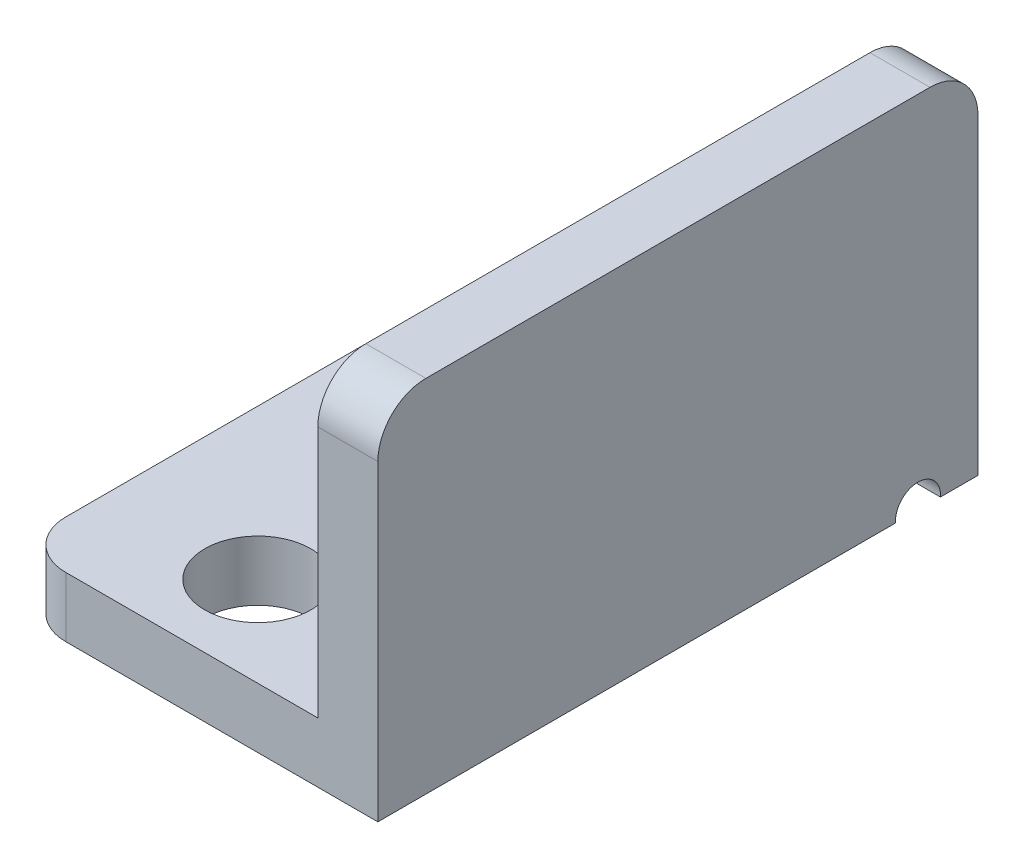
ISO-10303-21;
HEADER;
FILE_DESCRIPTION(('STEP AP214'),'2;1');
FILE_NAME('part.step','',(''),(''),'','','');
FILE_SCHEMA(('AUTOMOTIVE_DESIGN { 1 0 10303 214 1 1 1 1 }'));
ENDSEC;
DATA;
#1=APPLICATION_CONTEXT('core data for automotive mechanical design processes');
#2=APPLICATION_PROTOCOL_DEFINITION('international standard','automotive_design',2000,#1);
#3=PRODUCT_CONTEXT('',#1,'mechanical');
#4=PRODUCT('Part','Part','',(#3));
#5=PRODUCT_RELATED_PRODUCT_CATEGORY('part','',(#4));
#6=PRODUCT_DEFINITION_FORMATION('','',#4);
#7=PRODUCT_DEFINITION_CONTEXT('part definition',#1,'design');
#8=PRODUCT_DEFINITION('design','',#6,#7);
#9=PRODUCT_DEFINITION_SHAPE('','',#8);
#10=(LENGTH_UNIT() NAMED_UNIT(*) SI_UNIT(.MILLI.,.METRE.));
#11=(NAMED_UNIT(*) PLANE_ANGLE_UNIT() SI_UNIT($,.RADIAN.));
#12=(NAMED_UNIT(*) SI_UNIT($,.STERADIAN.) SOLID_ANGLE_UNIT());
#13=UNCERTAINTY_MEASURE_WITH_UNIT(LENGTH_MEASURE(1.E-05),#10,'distance_accuracy_value','');
#14=(GEOMETRIC_REPRESENTATION_CONTEXT(3) GLOBAL_UNCERTAINTY_ASSIGNED_CONTEXT((#13)) GLOBAL_UNIT_ASSIGNED_CONTEXT((#10,
#11,#12)) REPRESENTATION_CONTEXT('',''));
#15=CARTESIAN_POINT('',(0.,0.,0.));
#16=DIRECTION('',(0.,0.,1.));
#17=DIRECTION('',(1.,0.,0.));
#18=AXIS2_PLACEMENT_3D('',#15,#16,#17);
#19=CARTESIAN_POINT('',(0.,0.0889000000000011,3.175));
#20=DIRECTION('',(1.,0.,0.));
#21=DIRECTION('',(0.,0.,-1.));
#22=AXIS2_PLACEMENT_3D('',#19,#20,#21);
#23=CYLINDRICAL_SURFACE('',#22,1.190625);
#24=DIRECTION('',(1.,0.,0.));
#25=VECTOR('',#24,1.);
#26=CARTESIAN_POINT('',(0.,0.,4.3623014278712));
#27=LINE('',#26,#25);
#28=CARTESIAN_POINT('',(-8.33447804312745,0.,4.3623014278712));
#29=VERTEX_POINT('',#28);
#30=CARTESIAN_POINT('',(0.,0.,4.3623014278712));
#31=VERTEX_POINT('',#30);
#32=EDGE_CURVE('E162',#29,#31,#27,.T.);
#33=ORIENTED_EDGE('',*,*,#32,.F.);
#34=CARTESIAN_POINT('',(-8.33447804312745,0.,4.3623014278712));
#35=CARTESIAN_POINT('',(-8.33412602419344,0.0329451288291973,4.3647681140299));
#36=CARTESIAN_POINT('',(-8.33396807166116,0.0659792786716996,4.36586185376465));
#37=CARTESIAN_POINT('',(-8.33404673446812,0.132023038687931,4.36530244733317));
#38=CARTESIAN_POINT('',(-8.33428334082488,0.165032649403199,4.36364936370074));
#39=CARTESIAN_POINT('',(-8.33559371183046,0.263653267946129,4.3545748863936));
#40=CARTESIAN_POINT('',(-8.33726725503294,0.328926828317639,4.34304349858007));
#41=CARTESIAN_POINT('',(-8.34257098905646,0.456600016931958,4.30935083186281));
#42=CARTESIAN_POINT('',(-8.34620242152967,0.518997794126166,4.28718280841145));
#43=CARTESIAN_POINT('',(-8.35607524084338,0.63908808368808,4.2329303600525));
#44=CARTESIAN_POINT('',(-8.36231560966684,0.696782420874281,4.20084980432593));
#45=CARTESIAN_POINT('',(-8.37816814194478,0.80532388877314,4.12818143713237));
#46=CARTESIAN_POINT('',(-8.38775194370953,0.856223785032775,4.08766630519004));
#47=CARTESIAN_POINT('',(-8.41112154696961,0.950274802126868,3.99948437206178));
#48=CARTESIAN_POINT('',(-8.42490691120215,0.993426728561663,3.95181831534511));
#49=CARTESIAN_POINT('',(-8.45700166798826,1.0701258984744,3.85224155643223));
#50=CARTESIAN_POINT('',(-8.47521653513863,1.10384568861554,3.80043303540767));
#51=CARTESIAN_POINT('',(-8.51658902160822,1.16226411235994,3.69381944529985));
#52=CARTESIAN_POINT('',(-8.53974622594581,1.18696350288612,3.63901462808674));
#53=CARTESIAN_POINT('',(-8.59137801795512,1.22774029791511,3.52744973432427));
#54=CARTESIAN_POINT('',(-8.61993792111946,1.24366061344904,3.47067223115828));
#55=CARTESIAN_POINT('',(-8.68169992578058,1.26680473766953,3.35789221713217));
#56=CARTESIAN_POINT('',(-8.71490480635266,1.27402331508324,3.3018901924462));
#57=CARTESIAN_POINT('',(-8.79842610002928,1.28190316792409,3.17171633971098));
#58=CARTESIAN_POINT('',(-8.8505301864557,1.27915345858187,3.09848163686396));
#59=CARTESIAN_POINT('',(-8.96071649959419,1.26176568818811,2.95822751728016));
#60=CARTESIAN_POINT('',(-9.01880796688008,1.24710900327024,2.89121802057605));
#61=CARTESIAN_POINT('',(-9.16207454822033,1.20121148490903,2.74065530922964));
#62=CARTESIAN_POINT('',(-9.24925196991412,1.16581782673654,2.6602905830934));
#63=CARTESIAN_POINT('',(-9.42932550453559,1.08245304982875,2.51348577264447));
#64=CARTESIAN_POINT('',(-9.52223816403274,1.03444410035532,2.44708867141604));
#65=CARTESIAN_POINT('',(-9.68218297575382,0.945609031010432,2.34636214878501));
#66=CARTESIAN_POINT('',(-9.74833993676908,0.907147982641964,2.30846372451051));
#67=CARTESIAN_POINT('',(-9.88177749861832,0.826563601718093,2.23890189441795));
#68=CARTESIAN_POINT('',(-9.94905890269164,0.784437552095847,2.20724317219714));
#69=CARTESIAN_POINT('',(-10.083844643563,0.697032797000487,2.15007139777399));
#70=CARTESIAN_POINT('',(-10.1513477834565,0.651763502775847,2.12454093991667));
#71=CARTESIAN_POINT('',(-10.2858904475664,0.557821925313944,2.0793532067786));
#72=CARTESIAN_POINT('',(-10.3529304048483,0.509153493312229,2.05968941360544));
#73=CARTESIAN_POINT('',(-10.4401113928429,0.440825858416602,2.03743847875235));
#74=CARTESIAN_POINT('',(-10.4615275892411,0.423622311164334,2.03224848558493));
#75=CARTESIAN_POINT('',(-10.5038356374918,0.388373483218383,2.02250702655694));
#76=CARTESIAN_POINT('',(-10.5247272144877,0.37032777489317,2.01795588989995));
#77=CARTESIAN_POINT('',(-10.5648214075321,0.333759023411876,2.00968017115084));
#78=CARTESIAN_POINT('',(-10.5840579505545,0.315278821836948,2.00593110918635));
#79=CARTESIAN_POINT('',(-10.6209784436079,0.276676458549366,1.99911111759334));
#80=CARTESIAN_POINT('',(-10.6386645236216,0.256556625085713,1.9960392485754));
#81=CARTESIAN_POINT('',(-10.662831453418,0.224247069441891,1.99204281720061));
#82=CARTESIAN_POINT('',(-10.6705414927942,0.21303103503366,1.99080573908773));
#83=CARTESIAN_POINT('',(-10.6846307453939,0.189748539661888,1.98859607606964));
#84=CARTESIAN_POINT('',(-10.6910109949855,0.177682750838767,1.98762328501222));
#85=CARTESIAN_POINT('',(-10.7005933745614,0.155291603190863,1.98618653685294));
#86=CARTESIAN_POINT('',(-10.7041826446062,0.145140509365609,1.98565840101697));
#87=CARTESIAN_POINT('',(-10.7096549382316,0.124392362847905,1.98485916650902));
#88=CARTESIAN_POINT('',(-10.7115432883014,0.113796811842962,1.98458726530498));
#89=CARTESIAN_POINT('',(-10.7133183795463,0.0923566868732021,1.98433154264226));
#90=CARTESIAN_POINT('',(-10.7131917215066,0.0815109252003994,1.98434964965882));
#91=CARTESIAN_POINT('',(-10.7109226919746,0.0600036947773914,1.98467682311248));
#92=CARTESIAN_POINT('',(-10.7087726782944,0.0493430808760803,1.9849869926685));
#93=CARTESIAN_POINT('',(-10.703860201512,0.0322008490127459,1.98570652040927));
#94=CARTESIAN_POINT('',(-10.7015794330172,0.0255686747608661,1.98604257519978));
#95=CARTESIAN_POINT('',(-10.6964558748201,0.0125847495814886,1.98680568364873));
#96=CARTESIAN_POINT('',(-10.6936172931097,0.00623131002616738,1.98723205773381));
#97=CARTESIAN_POINT('',(-10.6905498537933,0.,1.9876985721288));
#98=B_SPLINE_CURVE_WITH_KNOTS('',3,(#34,#35,#36,#37,#38,#39,#40,#41,#42,#43,#44,#45,#46,#47,#48,
#49,#50,#51,#52,#53,#54,#55,#56,#57,#58,#59,#60,#61,#62,#63,#64,#65,#66,#67,#68,#69,#70,#71,#72,
#73,#74,#75,#76,#77,#78,#79,#80,#81,#82,#83,#84,#85,#86,#87,#88,#89,#90,#91,#92,#93,#94,#95,#96,
#97),.UNSPECIFIED.,.F.,.F.,(4,2,2,2,2,2,2,2,2,2,2,2,2,2,2,2,2,2,2,2,2,2,2,2,2,2,2,2,2,2,2,4),
(0.,0.0990569960588644,0.198111737031009,0.396011018379637,0.594035951165749,0.791983685870748,
0.988291536110394,1.18457896327541,1.37699751062786,1.56939990797578,1.76514175426163,
1.96100121718237,2.22927204521103,2.49796328910588,2.86716760838641,3.23749198985024,
3.49337587242719,3.7494510991743,4.0047901726456,4.25984449765961,4.34369890166973,
4.42759635857446,4.50836765389852,4.58902618972158,4.62996666521968,4.67087511356928,
4.70309945275852,4.73522252591205,4.76755929687826,4.80001869568113,4.82105670559346,
4.84194171429595),.UNSPECIFIED.);
#99=CARTESIAN_POINT('',(-10.6905498537933,0.,1.9876985721288));
#100=VERTEX_POINT('',#99);
#101=EDGE_CURVE('E144',#29,#100,#98,.T.);
#102=ORIENTED_EDGE('',*,*,#101,.T.);
#103=DIRECTION('',(1.,0.,0.));
#104=VECTOR('',#103,1.);
#105=CARTESIAN_POINT('',(0.,0.,1.9876985721288));
#106=LINE('',#105,#104);
#107=CARTESIAN_POINT('',(0.,0.,1.9876985721288));
#108=VERTEX_POINT('',#107);
#109=EDGE_CURVE('E154',#108,#100,#106,.F.);
#110=ORIENTED_EDGE('',*,*,#109,.F.);
#111=CARTESIAN_POINT('',(0.,0.0889000000000011,3.175));
#112=DIRECTION('',(1.,0.,0.));
#113=DIRECTION('',(0.,0.,-1.));
#114=AXIS2_PLACEMENT_3D('',#111,#112,#113);
#115=CIRCLE('',#114,1.190625);
#116=EDGE_CURVE('E209',#108,#31,#115,.T.);
#117=ORIENTED_EDGE('',*,*,#116,.T.);
#118=EDGE_LOOP('',(#33,#102,#110,#117));
#119=FACE_BOUND('',#118,.T.);
#120=ADVANCED_FACE('F33',(#119),#23,.F.);
#121=CARTESIAN_POINT('',(-3.175,3.175,31.75));
#122=DIRECTION('',(0.,-1.,0.));
#123=DIRECTION('',(1.,0.,0.));
#124=AXIS2_PLACEMENT_3D('',#121,#122,#123);
#125=PLANE('',#124);
#126=CARTESIAN_POINT('',(-11.1125,3.175,4.7625));
#127=DIRECTION('',(0.,1.,0.));
#128=DIRECTION('',(0.,0.,1.));
#129=AXIS2_PLACEMENT_3D('',#126,#127,#128);
#130=CIRCLE('',#129,2.80669999999999);
#131=CARTESIAN_POINT('',(-11.1125,3.175,7.56919999999999));
#132=VERTEX_POINT('',#131);
#133=EDGE_CURVE('E155',#132,#132,#130,.T.);
#134=ORIENTED_EDGE('',*,*,#133,.F.);
#135=EDGE_LOOP('',(#134));
#136=FACE_BOUND('',#135,.T.);
#137=DIRECTION('',(0.,0.,-1.));
#138=VECTOR('',#137,1.);
#139=CARTESIAN_POINT('',(-19.05,3.175,31.75));
#140=LINE('',#139,#138);
#141=CARTESIAN_POINT('',(-19.05,3.175,29.21));
#142=VERTEX_POINT('',#141);
#143=CARTESIAN_POINT('',(-19.05,3.175,2.54));
#144=VERTEX_POINT('',#143);
#145=EDGE_CURVE('E246',#142,#144,#140,.T.);
#146=ORIENTED_EDGE('',*,*,#145,.F.);
#147=CARTESIAN_POINT('',(-16.51,3.175,29.21));
#148=DIRECTION('',(0.,-1.,0.));
#149=DIRECTION('',(1.,0.,0.));
#150=AXIS2_PLACEMENT_3D('',#147,#148,#149);
#151=CIRCLE('',#150,2.54);
#152=CARTESIAN_POINT('',(-16.51,3.175,31.75));
#153=VERTEX_POINT('',#152);
#154=EDGE_CURVE('E308',#142,#153,#151,.F.);
#155=ORIENTED_EDGE('',*,*,#154,.T.);
#156=DIRECTION('',(-1.,0.,0.));
#157=VECTOR('',#156,1.);
#158=CARTESIAN_POINT('',(-3.175,3.175,31.75));
#159=LINE('',#158,#157);
#160=CARTESIAN_POINT('',(-3.175,3.175,31.75));
#161=VERTEX_POINT('',#160);
#162=EDGE_CURVE('E234',#161,#153,#159,.T.);
#163=ORIENTED_EDGE('',*,*,#162,.F.);
#164=DIRECTION('',(0.,0.,-1.));
#165=VECTOR('',#164,1.);
#166=CARTESIAN_POINT('',(-3.175,3.175,31.75));
#167=LINE('',#166,#165);
#168=CARTESIAN_POINT('',(-3.175,3.175,0.));
#169=VERTEX_POINT('',#168);
#170=EDGE_CURVE('E249',#161,#169,#167,.T.);
#171=ORIENTED_EDGE('',*,*,#170,.T.);
#172=DIRECTION('',(-1.,0.,0.));
#173=VECTOR('',#172,1.);
#174=CARTESIAN_POINT('',(-3.175,3.175,0.));
#175=LINE('',#174,#173);
#176=CARTESIAN_POINT('',(-16.51,3.175,0.));
#177=VERTEX_POINT('',#176);
#178=EDGE_CURVE('E229',#169,#177,#175,.T.);
#179=ORIENTED_EDGE('',*,*,#178,.T.);
#180=CARTESIAN_POINT('',(-16.51,3.175,2.54));
#181=DIRECTION('',(0.,-1.,0.));
#182=DIRECTION('',(1.,0.,0.));
#183=AXIS2_PLACEMENT_3D('',#180,#181,#182);
#184=CIRCLE('',#183,2.54);
#185=EDGE_CURVE('E306',#177,#144,#184,.F.);
#186=ORIENTED_EDGE('',*,*,#185,.T.);
#187=EDGE_LOOP('',(#146,#155,#163,#171,#179,#186));
#188=FACE_BOUND('',#187,.T.);
#189=CARTESIAN_POINT('',(-11.1125,3.175,26.9875));
#190=DIRECTION('',(0.,1.,0.));
#191=DIRECTION('',(0.,0.,1.));
#192=AXIS2_PLACEMENT_3D('',#189,#190,#191);
#193=CIRCLE('',#192,2.80669999999999);
#194=CARTESIAN_POINT('',(-11.1125,3.175,29.7942));
#195=VERTEX_POINT('',#194);
#196=EDGE_CURVE('E214',#195,#195,#193,.T.);
#197=ORIENTED_EDGE('',*,*,#196,.F.);
#198=EDGE_LOOP('',(#197));
#199=FACE_BOUND('',#198,.T.);
#200=ADVANCED_FACE('F198',(#136,#188,#199),#125,.F.);
#201=CARTESIAN_POINT('',(-19.05,0.,31.75));
#202=DIRECTION('',(0.,1.,0.));
#203=DIRECTION('',(0.,0.,1.));
#204=AXIS2_PLACEMENT_3D('',#201,#202,#203);
#205=PLANE('',#204);
#206=CARTESIAN_POINT('',(-11.1125,0.,26.9875));
#207=DIRECTION('',(0.,1.,0.));
#208=DIRECTION('',(0.,0.,1.));
#209=AXIS2_PLACEMENT_3D('',#206,#207,#208);
#210=CIRCLE('',#209,2.80669999999999);
#211=CARTESIAN_POINT('',(-11.1125,0.,29.7942));
#212=VERTEX_POINT('',#211);
#213=EDGE_CURVE('E216',#212,#212,#210,.T.);
#214=ORIENTED_EDGE('',*,*,#213,.T.);
#215=EDGE_LOOP('',(#214));
#216=FACE_BOUND('',#215,.T.);
#217=DIRECTION('',(1.,0.,0.));
#218=VECTOR('',#217,1.);
#219=CARTESIAN_POINT('',(-19.05,0.,31.75));
#220=LINE('',#219,#218);
#221=CARTESIAN_POINT('',(-16.51,0.,31.75));
#222=VERTEX_POINT('',#221);
#223=CARTESIAN_POINT('',(0.,0.,31.75));
#224=VERTEX_POINT('',#223);
#225=EDGE_CURVE('E226',#222,#224,#220,.T.);
#226=ORIENTED_EDGE('',*,*,#225,.F.);
#227=CARTESIAN_POINT('',(-16.51,0.,29.21));
#228=DIRECTION('',(0.,1.,0.));
#229=DIRECTION('',(0.,0.,1.));
#230=AXIS2_PLACEMENT_3D('',#227,#228,#229);
#231=CIRCLE('',#230,2.54);
#232=CARTESIAN_POINT('',(-19.05,0.,29.21));
#233=VERTEX_POINT('',#232);
#234=EDGE_CURVE('E297',#222,#233,#231,.F.);
#235=ORIENTED_EDGE('',*,*,#234,.T.);
#236=DIRECTION('',(0.,0.,-1.));
#237=VECTOR('',#236,1.);
#238=CARTESIAN_POINT('',(-19.05,0.,31.75));
#239=LINE('',#238,#237);
#240=CARTESIAN_POINT('',(-19.05,0.,4.3623014278712));
#241=VERTEX_POINT('',#240);
#242=EDGE_CURVE('E237',#233,#241,#239,.T.);
#243=ORIENTED_EDGE('',*,*,#242,.T.);
#244=CARTESIAN_POINT('',(-13.8905219568726,0.,4.3623014278712));
#245=VERTEX_POINT('',#244);
#246=EDGE_CURVE('E145',#241,#245,#27,.T.);
#247=ORIENTED_EDGE('',*,*,#246,.T.);
#248=CARTESIAN_POINT('',(-11.1125,0.,4.7625));
#249=DIRECTION('',(0.,1.,0.));
#250=DIRECTION('',(0.,0.,1.));
#251=AXIS2_PLACEMENT_3D('',#248,#249,#250);
#252=CIRCLE('',#251,2.80669999999999);
#253=EDGE_CURVE('E139',#245,#29,#252,.T.);
#254=ORIENTED_EDGE('',*,*,#253,.T.);
#255=ORIENTED_EDGE('',*,*,#32,.T.);
#256=DIRECTION('',(0.,0.,-1.));
#257=VECTOR('',#256,1.);
#258=CARTESIAN_POINT('',(0.,0.,31.75));
#259=LINE('',#258,#257);
#260=EDGE_CURVE('E160',#224,#31,#259,.T.);
#261=ORIENTED_EDGE('',*,*,#260,.F.);
#262=EDGE_LOOP('',(#226,#235,#243,#247,#254,#255,#261));
#263=FACE_BOUND('',#262,.T.);
#264=ADVANCED_FACE('F203',(#216,#263),#205,.F.);
#265=CARTESIAN_POINT('',(-11.5344501462067,0.,1.9876985721288));
#266=VERTEX_POINT('',#265);
#267=CARTESIAN_POINT('',(-18.9892263173763,0.,1.9876985721288));
#268=VERTEX_POINT('',#267);
#269=EDGE_CURVE('E151',#266,#268,#106,.F.);
#270=ORIENTED_EDGE('',*,*,#269,.T.);
#271=CARTESIAN_POINT('',(-16.51,0.,2.54));
#272=DIRECTION('',(0.,1.,0.));
#273=DIRECTION('',(0.,0.,1.));
#274=AXIS2_PLACEMENT_3D('',#271,#272,#273);
#275=CIRCLE('',#274,2.54);
#276=CARTESIAN_POINT('',(-16.51,0.,0.));
#277=VERTEX_POINT('',#276);
#278=EDGE_CURVE('E269',#268,#277,#275,.F.);
#279=ORIENTED_EDGE('',*,*,#278,.T.);
#280=DIRECTION('',(1.,0.,0.));
#281=VECTOR('',#280,1.);
#282=CARTESIAN_POINT('',(-19.05,0.,0.));
#283=LINE('',#282,#281);
#284=CARTESIAN_POINT('',(0.,0.,0.));
#285=VERTEX_POINT('',#284);
#286=EDGE_CURVE('E225',#277,#285,#283,.T.);
#287=ORIENTED_EDGE('',*,*,#286,.T.);
#288=EDGE_CURVE('E164',#108,#285,#259,.T.);
#289=ORIENTED_EDGE('',*,*,#288,.F.);
#290=ORIENTED_EDGE('',*,*,#109,.T.);
#291=CARTESIAN_POINT('',(-11.1125,0.,4.7625));
#292=DIRECTION('',(0.,1.,0.));
#293=DIRECTION('',(0.,0.,1.));
#294=AXIS2_PLACEMENT_3D('',#291,#292,#293);
#295=CIRCLE('',#294,2.80669999999999);
#296=EDGE_CURVE('E136',#100,#266,#295,.T.);
#297=ORIENTED_EDGE('',*,*,#296,.T.);
#298=EDGE_LOOP('',(#270,#279,#287,#289,#290,#297));
#299=FACE_BOUND('',#298,.T.);
#300=ADVANCED_FACE('F150',(#299),#205,.F.);
#301=CARTESIAN_POINT('',(0.,0.,31.75));
#302=DIRECTION('',(-1.,0.,0.));
#303=DIRECTION('',(0.,0.,1.));
#304=AXIS2_PLACEMENT_3D('',#301,#302,#303);
#305=PLANE('',#304);
#306=DIRECTION('',(0.,0.,-1.));
#307=VECTOR('',#306,1.);
#308=CARTESIAN_POINT('',(0.,19.05,31.75));
#309=LINE('',#308,#307);
#310=CARTESIAN_POINT('',(0.,19.05,29.21));
#311=VERTEX_POINT('',#310);
#312=CARTESIAN_POINT('',(0.,19.05,2.54));
#313=VERTEX_POINT('',#312);
#314=EDGE_CURVE('E254',#311,#313,#309,.T.);
#315=ORIENTED_EDGE('',*,*,#314,.F.);
#316=CARTESIAN_POINT('',(0.,16.51,29.21));
#317=DIRECTION('',(-1.,0.,0.));
#318=DIRECTION('',(0.,0.,1.));
#319=AXIS2_PLACEMENT_3D('',#316,#317,#318);
#320=CIRCLE('',#319,2.54);
#321=CARTESIAN_POINT('',(0.,16.51,31.75));
#322=VERTEX_POINT('',#321);
#323=EDGE_CURVE('E11',#311,#322,#320,.F.);
#324=ORIENTED_EDGE('',*,*,#323,.T.);
#325=DIRECTION('',(0.,1.,0.));
#326=VECTOR('',#325,1.);
#327=CARTESIAN_POINT('',(0.,0.,31.75));
#328=LINE('',#327,#326);
#329=EDGE_CURVE('E228',#224,#322,#328,.T.);
#330=ORIENTED_EDGE('',*,*,#329,.F.);
#331=ORIENTED_EDGE('',*,*,#260,.T.);
#332=ORIENTED_EDGE('',*,*,#116,.F.);
#333=ORIENTED_EDGE('',*,*,#288,.T.);
#334=DIRECTION('',(0.,1.,0.));
#335=VECTOR('',#334,1.);
#336=CARTESIAN_POINT('',(0.,0.,0.));
#337=LINE('',#336,#335);
#338=CARTESIAN_POINT('',(0.,16.51,0.));
#339=VERTEX_POINT('',#338);
#340=EDGE_CURVE('E239',#285,#339,#337,.T.);
#341=ORIENTED_EDGE('',*,*,#340,.T.);
#342=CARTESIAN_POINT('',(0.,16.51,2.54));
#343=DIRECTION('',(-1.,0.,0.));
#344=DIRECTION('',(0.,0.,1.));
#345=AXIS2_PLACEMENT_3D('',#342,#343,#344);
#346=CIRCLE('',#345,2.54);
#347=EDGE_CURVE('E41',#339,#313,#346,.F.);
#348=ORIENTED_EDGE('',*,*,#347,.T.);
#349=EDGE_LOOP('',(#315,#324,#330,#331,#332,#333,#341,#348));
#350=FACE_BOUND('',#349,.T.);
#351=ADVANCED_FACE('F259',(#350),#305,.F.);
#352=CARTESIAN_POINT('',(0.,19.05,31.75));
#353=DIRECTION('',(0.,-1.,0.));
#354=DIRECTION('',(0.,0.,-1.));
#355=AXIS2_PLACEMENT_3D('',#352,#353,#354);
#356=PLANE('',#355);
#357=DIRECTION('',(0.,0.,-1.));
#358=VECTOR('',#357,1.);
#359=CARTESIAN_POINT('',(-3.175,19.05,31.75));
#360=LINE('',#359,#358);
#361=CARTESIAN_POINT('',(-3.175,19.05,29.21));
#362=VERTEX_POINT('',#361);
#363=CARTESIAN_POINT('',(-3.175,19.05,2.54));
#364=VERTEX_POINT('',#363);
#365=EDGE_CURVE('E252',#362,#364,#360,.T.);
#366=ORIENTED_EDGE('',*,*,#365,.F.);
#367=DIRECTION('',(-1.,0.,0.));
#368=VECTOR('',#367,1.);
#369=CARTESIAN_POINT('',(0.,19.05,29.21));
#370=LINE('',#369,#368);
#371=EDGE_CURVE('E54',#362,#311,#370,.F.);
#372=ORIENTED_EDGE('',*,*,#371,.T.);
#373=ORIENTED_EDGE('',*,*,#314,.T.);
#374=DIRECTION('',(-1.,0.,0.));
#375=VECTOR('',#374,1.);
#376=CARTESIAN_POINT('',(0.,19.05,2.54));
#377=LINE('',#376,#375);
#378=EDGE_CURVE('E279',#313,#364,#377,.T.);
#379=ORIENTED_EDGE('',*,*,#378,.T.);
#380=EDGE_LOOP('',(#366,#372,#373,#379));
#381=FACE_BOUND('',#380,.T.);
#382=ADVANCED_FACE('F281',(#381),#356,.F.);
#383=CARTESIAN_POINT('',(-3.175,19.05,31.75));
#384=DIRECTION('',(1.,0.,0.));
#385=DIRECTION('',(0.,1.,0.));
#386=AXIS2_PLACEMENT_3D('',#383,#384,#385);
#387=PLANE('',#386);
#388=DIRECTION('',(0.,-1.,0.));
#389=VECTOR('',#388,1.);
#390=CARTESIAN_POINT('',(-3.175,19.05,31.75));
#391=LINE('',#390,#389);
#392=CARTESIAN_POINT('',(-3.175,16.51,31.75));
#393=VERTEX_POINT('',#392);
#394=EDGE_CURVE('E232',#393,#161,#391,.T.);
#395=ORIENTED_EDGE('',*,*,#394,.F.);
#396=CARTESIAN_POINT('',(-3.175,16.51,29.21));
#397=DIRECTION('',(1.,0.,0.));
#398=DIRECTION('',(0.,1.,0.));
#399=AXIS2_PLACEMENT_3D('',#396,#397,#398);
#400=CIRCLE('',#399,2.54);
#401=EDGE_CURVE('E277',#393,#362,#400,.F.);
#402=ORIENTED_EDGE('',*,*,#401,.T.);
#403=ORIENTED_EDGE('',*,*,#365,.T.);
#404=CARTESIAN_POINT('',(-3.175,16.51,2.54));
#405=DIRECTION('',(1.,0.,0.));
#406=DIRECTION('',(0.,1.,0.));
#407=AXIS2_PLACEMENT_3D('',#404,#405,#406);
#408=CIRCLE('',#407,2.54);
#409=CARTESIAN_POINT('',(-3.175,16.51,0.));
#410=VERTEX_POINT('',#409);
#411=EDGE_CURVE('E271',#364,#410,#408,.F.);
#412=ORIENTED_EDGE('',*,*,#411,.T.);
#413=DIRECTION('',(0.,-1.,0.));
#414=VECTOR('',#413,1.);
#415=CARTESIAN_POINT('',(-3.175,19.05,0.));
#416=LINE('',#415,#414);
#417=EDGE_CURVE('E241',#410,#169,#416,.T.);
#418=ORIENTED_EDGE('',*,*,#417,.T.);
#419=ORIENTED_EDGE('',*,*,#170,.F.);
#420=EDGE_LOOP('',(#395,#402,#403,#412,#418,#419));
#421=FACE_BOUND('',#420,.T.);
#422=ADVANCED_FACE('F284',(#421),#387,.F.);
#423=CARTESIAN_POINT('',(-19.05,3.175,31.75));
#424=DIRECTION('',(1.,0.,0.));
#425=DIRECTION('',(0.,0.,-1.));
#426=AXIS2_PLACEMENT_3D('',#423,#424,#425);
#427=PLANE('',#426);
#428=ORIENTED_EDGE('',*,*,#242,.F.);
#429=DIRECTION('',(0.,-1.,0.));
#430=VECTOR('',#429,1.);
#431=CARTESIAN_POINT('',(-19.05,3.175,29.21));
#432=LINE('',#431,#430);
#433=EDGE_CURVE('E304',#233,#142,#432,.F.);
#434=ORIENTED_EDGE('',*,*,#433,.T.);
#435=ORIENTED_EDGE('',*,*,#145,.T.);
#436=DIRECTION('',(0.,-1.,0.));
#437=VECTOR('',#436,1.);
#438=CARTESIAN_POINT('',(-19.05,3.175,2.54));
#439=LINE('',#438,#437);
#440=CARTESIAN_POINT('',(-19.05,1.09605584227318,2.54));
#441=VERTEX_POINT('',#440);
#442=EDGE_CURVE('E301',#144,#441,#439,.T.);
#443=ORIENTED_EDGE('',*,*,#442,.T.);
#444=CARTESIAN_POINT('',(-19.05,0.0889000000000011,3.175));
#445=DIRECTION('',(1.,0.,0.));
#446=DIRECTION('',(0.,0.,-1.));
#447=AXIS2_PLACEMENT_3D('',#444,#445,#446);
#448=CIRCLE('',#447,1.190625);
#449=EDGE_CURVE('E223',#441,#241,#448,.T.);
#450=ORIENTED_EDGE('',*,*,#449,.T.);
#451=EDGE_LOOP('',(#428,#434,#435,#443,#450));
#452=FACE_BOUND('',#451,.T.);
#453=ADVANCED_FACE('F370',(#452),#427,.F.);
#454=CARTESIAN_POINT('',(0.,0.,31.75));
#455=DIRECTION('',(0.,0.,1.));
#456=DIRECTION('',(1.,0.,0.));
#457=AXIS2_PLACEMENT_3D('',#454,#455,#456);
#458=PLANE('',#457);
#459=ORIENTED_EDGE('',*,*,#162,.T.);
#460=DIRECTION('',(0.,-1.,0.));
#461=VECTOR('',#460,1.);
#462=CARTESIAN_POINT('',(-16.51,0.,31.75));
#463=LINE('',#462,#461);
#464=EDGE_CURVE('E295',#153,#222,#463,.T.);
#465=ORIENTED_EDGE('',*,*,#464,.T.);
#466=ORIENTED_EDGE('',*,*,#225,.T.);
#467=ORIENTED_EDGE('',*,*,#329,.T.);
#468=DIRECTION('',(-1.,0.,0.));
#469=VECTOR('',#468,1.);
#470=CARTESIAN_POINT('',(-3.175,16.51,31.75));
#471=LINE('',#470,#469);
#472=EDGE_CURVE('E291',#322,#393,#471,.T.);
#473=ORIENTED_EDGE('',*,*,#472,.T.);
#474=ORIENTED_EDGE('',*,*,#394,.T.);
#475=EDGE_LOOP('',(#459,#465,#466,#467,#473,#474));
#476=FACE_BOUND('',#475,.T.);
#477=ADVANCED_FACE('F293',(#476),#458,.T.);
#478=CARTESIAN_POINT('',(0.,0.,0.));
#479=DIRECTION('',(0.,0.,1.));
#480=DIRECTION('',(1.,0.,0.));
#481=AXIS2_PLACEMENT_3D('',#478,#479,#480);
#482=PLANE('',#481);
#483=ORIENTED_EDGE('',*,*,#286,.F.);
#484=DIRECTION('',(0.,-1.,0.));
#485=VECTOR('',#484,1.);
#486=CARTESIAN_POINT('',(-16.51,0.,0.));
#487=LINE('',#486,#485);
#488=EDGE_CURVE('E268',#277,#177,#487,.F.);
#489=ORIENTED_EDGE('',*,*,#488,.T.);
#490=ORIENTED_EDGE('',*,*,#178,.F.);
#491=ORIENTED_EDGE('',*,*,#417,.F.);
#492=DIRECTION('',(-1.,0.,0.));
#493=VECTOR('',#492,1.);
#494=CARTESIAN_POINT('',(0.,16.51,0.));
#495=LINE('',#494,#493);
#496=EDGE_CURVE('E265',#410,#339,#495,.F.);
#497=ORIENTED_EDGE('',*,*,#496,.T.);
#498=ORIENTED_EDGE('',*,*,#340,.F.);
#499=EDGE_LOOP('',(#483,#489,#490,#491,#497,#498));
#500=FACE_BOUND('',#499,.T.);
#501=ADVANCED_FACE('F194',(#500),#482,.F.);
#502=ORIENTED_EDGE('',*,*,#449,.F.);
#503=CARTESIAN_POINT('',(-19.05,1.09605584227318,2.54));
#504=CARTESIAN_POINT('',(-19.0500013339671,1.07835128901814,2.51191822540147));
#505=CARTESIAN_POINT('',(-19.0495341322766,1.05948135061786,2.48459486758687));
#506=CARTESIAN_POINT('',(-19.0478255417744,1.01954760142604,2.431640844201));
#507=CARTESIAN_POINT('',(-19.0465844154161,0.998484536383965,2.40600960805468));
#508=CARTESIAN_POINT('',(-19.0419517073401,0.932305247696917,2.33201688478769));
#509=CARTESIAN_POINT('',(-19.0376491232028,0.884106548774773,2.28641033612358));
#510=CARTESIAN_POINT('',(-19.0280101774527,0.780953606648444,2.20390991072936));
#511=CARTESIAN_POINT('',(-19.0226745283926,0.726004029330841,2.16701006728188));
#512=CARTESIAN_POINT('',(-19.0122977250075,0.610693879120738,2.10277186795413));
#513=CARTESIAN_POINT('',(-19.0072567428717,0.55033019367554,2.07543905696705));
#514=CARTESIAN_POINT('',(-18.9985317596069,0.424748187116851,2.03074719838005));
#515=CARTESIAN_POINT('',(-18.9948724596966,0.359464461080012,2.01356685721392));
#516=CARTESIAN_POINT('',(-18.9898804522351,0.226939642190032,1.99050170472693));
#517=CARTESIAN_POINT('',(-18.9885432068837,0.159702628661128,1.98459486029357));
#518=CARTESIAN_POINT('',(-18.988457967311,0.061627114279811,1.98428193763207));
#519=CARTESIAN_POINT('',(-18.9887011750353,0.0307569355945145,1.98538545194613));
#520=CARTESIAN_POINT('',(-18.9892263173764,0.,1.9876985721288));
#521=B_SPLINE_CURVE_WITH_KNOTS('',3,(#503,#504,#505,#506,#507,#508,#509,#510,#511,#512,#513,
#514,#515,#516,#517,#518,#519,#520),.UNSPECIFIED.,.F.,.F.,(4,2,2,2,2,2,2,2,4),(0.,
0.0995212163729455,0.199008701449675,0.397472065681589,0.595799025088021,0.794240741909034,
0.996078771583451,1.19752192002129,1.29009015275105),.UNSPECIFIED.);
#522=EDGE_CURVE('E159',#441,#268,#521,.T.);
#523=ORIENTED_EDGE('',*,*,#522,.T.);
#524=ORIENTED_EDGE('',*,*,#269,.F.);
#525=CARTESIAN_POINT('',(-11.5344501462067,0.,1.9876985721288));
#526=CARTESIAN_POINT('',(-11.5295844094148,0.00984040490353467,1.98695895160368));
#527=CARTESIAN_POINT('',(-11.5253019947705,0.0200442250418683,1.98632077226882));
#528=CARTESIAN_POINT('',(-11.5183280947604,0.0410165570775654,1.98529248264445));
#529=CARTESIAN_POINT('',(-11.5156411514257,0.0517865870271876,1.98490308034353));
#530=CARTESIAN_POINT('',(-11.5122970026371,0.0737896476550819,1.98441965337413));
#531=CARTESIAN_POINT('',(-11.5116620712772,0.085026426881642,1.98432886995443));
#532=CARTESIAN_POINT('',(-11.5126135465244,0.107353587176468,1.98446576601695));
#533=CARTESIAN_POINT('',(-11.5141919470485,0.118444350165629,1.98469229770106));
#534=CARTESIAN_POINT('',(-11.5196476317163,0.141853534599759,1.98548654764683));
#535=CARTESIAN_POINT('',(-11.5238460355556,0.154092443136926,1.98610211378489));
#536=CARTESIAN_POINT('',(-11.5340844247922,0.177787011824025,1.98763799164293));
#537=CARTESIAN_POINT('',(-11.5401338182542,0.189238295797926,1.98855986232914));
#538=CARTESIAN_POINT('',(-11.5641268104703,0.229308814380571,1.99232043174576));
#539=CARTESIAN_POINT('',(-11.5854825362777,0.255737961426391,1.99584774765091));
#540=CARTESIAN_POINT('',(-11.6310726363098,0.305772002395841,2.00402074020076));
#541=CARTESIAN_POINT('',(-11.655327162684,0.329354525001675,2.0086745077101));
#542=CARTESIAN_POINT('',(-11.7055947662124,0.375160823356008,2.01905880747098));
#543=CARTESIAN_POINT('',(-11.7316291539055,0.397358120587416,2.02480480074066));
#544=CARTESIAN_POINT('',(-11.7844235816823,0.4405900689481,2.03728000675883));
#545=CARTESIAN_POINT('',(-11.8111841422259,0.461623851506392,2.04400994072867));
#546=CARTESIAN_POINT('',(-11.8921300191465,0.523538110141108,2.06567643499736));
#547=CARTESIAN_POINT('',(-11.9468953728144,0.563159855340665,2.08207273263526));
#548=CARTESIAN_POINT('',(-12.0567172154181,0.640025730077692,2.11875627009515));
#549=CARTESIAN_POINT('',(-12.1117735244597,0.677271176563698,2.13904132935077));
#550=CARTESIAN_POINT('',(-12.2216520708182,0.749554436412479,2.18357449860341));
#551=CARTESIAN_POINT('',(-12.2764744838619,0.784594364197623,2.20781873024196));
#552=CARTESIAN_POINT('',(-12.3855637981757,0.852392334967442,2.26039335917686));
#553=CARTESIAN_POINT('',(-12.4398308263021,0.885150909431915,2.28872280000048));
#554=CARTESIAN_POINT('',(-12.5475048742591,0.948082944905657,2.34958496015574));
#555=CARTESIAN_POINT('',(-12.6009115591632,0.978255418009643,2.38211927397519));
#556=CARTESIAN_POINT('',(-12.7591435713644,1.06413299714242,2.48610007506473));
#557=CARTESIAN_POINT('',(-12.8623244653743,1.1154143331244,2.56408638350213));
#558=CARTESIAN_POINT('',(-13.0301695719137,1.18745070205945,2.71104645901846));
#559=CARTESIAN_POINT('',(-13.0969268004797,1.21274382457737,2.77542613783268));
#560=CARTESIAN_POINT('',(-13.2251742392764,1.2523814138607,2.91238443230629));
#561=CARTESIAN_POINT('',(-13.2866701475964,1.26673786194082,2.98495397543203));
#562=CARTESIAN_POINT('',(-13.3915977464942,1.2799810869131,3.12259284994566));
#563=CARTESIAN_POINT('',(-13.4362479054782,1.2812768098342,3.18649142025197));
#564=CARTESIAN_POINT('',(-13.5197809573836,1.2728009338458,3.31731254516713));
#565=CARTESIAN_POINT('',(-13.5586671819284,1.26303575670163,3.38423332348643));
#566=CARTESIAN_POINT('',(-13.6300101407275,1.23078874792905,3.51928478108565));
#567=CARTESIAN_POINT('',(-13.6624097443909,1.20820011386123,3.58742090599351));
#568=CARTESIAN_POINT('',(-13.7197985161455,1.149481663765,3.72094594392996));
#569=CARTESIAN_POINT('',(-13.7447929248589,1.11336146515276,3.78633677152838));
#570=CARTESIAN_POINT('',(-13.7846011829901,1.03411193753464,3.90188854743705));
#571=CARTESIAN_POINT('',(-13.8003518411274,0.99267952231083,3.9528986256112));
#572=CARTESIAN_POINT('',(-13.8271718992311,0.901222572547482,4.04796332053197));
#573=CARTESIAN_POINT('',(-13.838242622222,0.851200471955509,4.09201990083271));
#574=CARTESIAN_POINT('',(-13.8561228132678,0.746576636003596,4.16953074996873));
#575=CARTESIAN_POINT('',(-13.8631080346711,0.692300439427161,4.2033858652011));
#576=CARTESIAN_POINT('',(-13.8743865806753,0.578777090202853,4.26205635937812));
#577=CARTESIAN_POINT('',(-13.8786786496064,0.519527633369998,4.28686751936483));
#578=CARTESIAN_POINT('',(-13.8852847431606,0.396656888578053,4.32700995842155));
#579=CARTESIAN_POINT('',(-13.887562994725,0.332977408773241,4.34216850530956));
#580=CARTESIAN_POINT('',(-13.8904735466989,0.204052582830405,4.36182924785021));
#581=CARTESIAN_POINT('',(-13.8911089825103,0.13881045974731,4.36635174148889));
#582=CARTESIAN_POINT('',(-13.890937954281,0.0490973247714409,4.36521670122341));
#583=CARTESIAN_POINT('',(-13.8907825948938,0.0245129566589621,4.36414204352974));
#584=CARTESIAN_POINT('',(-13.8905219568726,0.,4.3623014278712));
#585=B_SPLINE_CURVE_WITH_KNOTS('',3,(#525,#526,#527,#528,#529,#530,#531,#532,#533,#534,#535,
#536,#537,#538,#539,#540,#541,#542,#543,#544,#545,#546,#547,#548,#549,#550,#551,#552,#553,#554,
#555,#556,#557,#558,#559,#560,#561,#562,#563,#564,#565,#566,#567,#568,#569,#570,#571,#572,#573,
#574,#575,#576,#577,#578,#579,#580,#581,#582,#583,#584),.UNSPECIFIED.,.F.,.F.,(4,2,2,2,2,2,2,2,
2,2,2,2,2,2,2,2,2,2,2,2,2,2,2,2,2,2,2,2,2,4),(0.,0.0330801610639167,0.0662540496604091,
0.0997868441926697,0.133198656018495,0.171839471734448,0.210680045572937,0.312343648915843,
0.414760340182468,0.518752331697356,0.622820934332446,0.8312926471905,1.03964780270151,
1.24780006697946,1.45590367531887,1.66408642935349,2.07915277945535,2.36667842817952,
2.65388863283124,2.88687315020271,3.11972247013696,3.35454018247491,3.58919131626967,
3.79088614879629,3.99252392370239,4.18468913091298,4.3769438678113,4.57254886334285,
4.76778025969902,4.84155288095196),.UNSPECIFIED.);
#586=EDGE_CURVE('E133',#266,#245,#585,.T.);
#587=ORIENTED_EDGE('',*,*,#586,.T.);
#588=ORIENTED_EDGE('',*,*,#246,.F.);
#589=EDGE_LOOP('',(#502,#523,#524,#587,#588));
#590=FACE_BOUND('',#589,.T.);
#591=ADVANCED_FACE('F158',(#590),#23,.F.);
#592=CARTESIAN_POINT('',(-11.1125,3.175,26.9875));
#593=DIRECTION('',(0.,1.,0.));
#594=DIRECTION('',(0.,0.,1.));
#595=AXIS2_PLACEMENT_3D('',#592,#593,#594);
#596=CYLINDRICAL_SURFACE('',#595,2.80669999999999);
#597=ORIENTED_EDGE('',*,*,#196,.T.);
#598=EDGE_LOOP('',(#597));
#599=FACE_BOUND('',#598,.T.);
#600=ORIENTED_EDGE('',*,*,#213,.F.);
#601=EDGE_LOOP('',(#600));
#602=FACE_BOUND('',#601,.T.);
#603=ADVANCED_FACE('F186',(#599,#602),#596,.F.);
#604=CARTESIAN_POINT('',(-11.1125,3.175,4.7625));
#605=DIRECTION('',(0.,1.,0.));
#606=DIRECTION('',(0.,0.,1.));
#607=AXIS2_PLACEMENT_3D('',#604,#605,#606);
#608=CYLINDRICAL_SURFACE('',#607,2.80669999999999);
#609=ORIENTED_EDGE('',*,*,#133,.T.);
#610=EDGE_LOOP('',(#609));
#611=FACE_BOUND('',#610,.T.);
#612=ORIENTED_EDGE('',*,*,#253,.F.);
#613=ORIENTED_EDGE('',*,*,#586,.F.);
#614=ORIENTED_EDGE('',*,*,#296,.F.);
#615=ORIENTED_EDGE('',*,*,#101,.F.);
#616=EDGE_LOOP('',(#612,#613,#614,#615));
#617=FACE_BOUND('',#616,.T.);
#618=ADVANCED_FACE('F135',(#611,#617),#608,.F.);
#619=CARTESIAN_POINT('',(-16.51,0.,29.21));
#620=DIRECTION('',(0.,1.,0.));
#621=DIRECTION('',(0.,0.,1.));
#622=AXIS2_PLACEMENT_3D('',#619,#620,#621);
#623=CYLINDRICAL_SURFACE('',#622,2.54);
#624=ORIENTED_EDGE('',*,*,#154,.F.);
#625=ORIENTED_EDGE('',*,*,#433,.F.);
#626=ORIENTED_EDGE('',*,*,#234,.F.);
#627=ORIENTED_EDGE('',*,*,#464,.F.);
#628=EDGE_LOOP('',(#624,#625,#626,#627));
#629=FACE_BOUND('',#628,.T.);
#630=ADVANCED_FACE('F185',(#629),#623,.T.);
#631=CARTESIAN_POINT('',(-16.51,3.175,2.54));
#632=DIRECTION('',(0.,-1.,0.));
#633=DIRECTION('',(0.,0.,-1.));
#634=AXIS2_PLACEMENT_3D('',#631,#632,#633);
#635=CYLINDRICAL_SURFACE('',#634,2.54);
#636=ORIENTED_EDGE('',*,*,#185,.F.);
#637=ORIENTED_EDGE('',*,*,#488,.F.);
#638=ORIENTED_EDGE('',*,*,#278,.F.);
#639=ORIENTED_EDGE('',*,*,#522,.F.);
#640=ORIENTED_EDGE('',*,*,#442,.F.);
#641=EDGE_LOOP('',(#636,#637,#638,#639,#640));
#642=FACE_BOUND('',#641,.T.);
#643=ADVANCED_FACE('F314',(#642),#635,.T.);
#644=CARTESIAN_POINT('',(0.,16.51,29.21));
#645=DIRECTION('',(1.,0.,0.));
#646=DIRECTION('',(0.,0.,-1.));
#647=AXIS2_PLACEMENT_3D('',#644,#645,#646);
#648=CYLINDRICAL_SURFACE('',#647,2.54);
#649=ORIENTED_EDGE('',*,*,#323,.F.);
#650=ORIENTED_EDGE('',*,*,#371,.F.);
#651=ORIENTED_EDGE('',*,*,#401,.F.);
#652=ORIENTED_EDGE('',*,*,#472,.F.);
#653=EDGE_LOOP('',(#649,#650,#651,#652));
#654=FACE_BOUND('',#653,.T.);
#655=ADVANCED_FACE('F290',(#654),#648,.T.);
#656=CARTESIAN_POINT('',(0.,16.51,2.54));
#657=DIRECTION('',(-1.,0.,0.));
#658=DIRECTION('',(0.,0.,1.));
#659=AXIS2_PLACEMENT_3D('',#656,#657,#658);
#660=CYLINDRICAL_SURFACE('',#659,2.54);
#661=ORIENTED_EDGE('',*,*,#347,.F.);
#662=ORIENTED_EDGE('',*,*,#496,.F.);
#663=ORIENTED_EDGE('',*,*,#411,.F.);
#664=ORIENTED_EDGE('',*,*,#378,.F.);
#665=EDGE_LOOP('',(#661,#662,#663,#664));
#666=FACE_BOUND('',#665,.T.);
#667=ADVANCED_FACE('F35',(#666),#660,.T.);
#668=CLOSED_SHELL('',(#120,#200,#264,#300,#351,#382,#422,#453,#477,#501,#591,#603,#618,#630,
#643,#655,#667));
#669=MANIFOLD_SOLID_BREP('B2',#668);
#670=ADVANCED_BREP_SHAPE_REPRESENTATION('',(#18,#669),#14);
#671=SHAPE_DEFINITION_REPRESENTATION(#9,#670);
ENDSEC;
END-ISO-10303-21;
